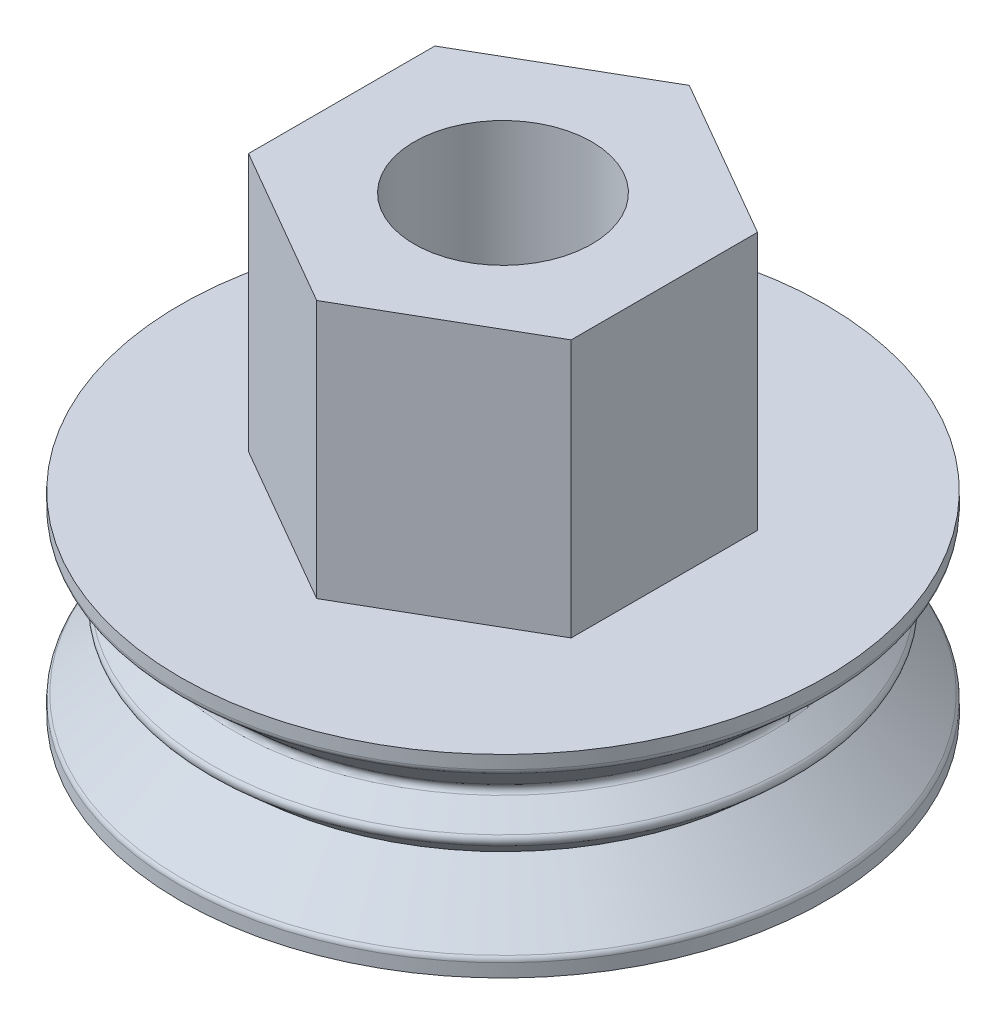
ISO-10303-21;
HEADER;
FILE_DESCRIPTION(('STEP AP214'),'2;1');
FILE_NAME('part.step','',(''),(''),'','','');
FILE_SCHEMA(('AUTOMOTIVE_DESIGN { 1 0 10303 214 1 1 1 1 }'));
ENDSEC;
DATA;
#1=APPLICATION_CONTEXT('core data for automotive mechanical design processes');
#2=APPLICATION_PROTOCOL_DEFINITION('international standard','automotive_design',2000,#1);
#3=PRODUCT_CONTEXT('',#1,'mechanical');
#4=PRODUCT('Part','Part','',(#3));
#5=PRODUCT_RELATED_PRODUCT_CATEGORY('part','',(#4));
#6=PRODUCT_DEFINITION_FORMATION('','',#4);
#7=PRODUCT_DEFINITION_CONTEXT('part definition',#1,'design');
#8=PRODUCT_DEFINITION('design','',#6,#7);
#9=PRODUCT_DEFINITION_SHAPE('','',#8);
#10=(LENGTH_UNIT() NAMED_UNIT(*) SI_UNIT(.MILLI.,.METRE.));
#11=(NAMED_UNIT(*) PLANE_ANGLE_UNIT() SI_UNIT($,.RADIAN.));
#12=(NAMED_UNIT(*) SI_UNIT($,.STERADIAN.) SOLID_ANGLE_UNIT());
#13=UNCERTAINTY_MEASURE_WITH_UNIT(LENGTH_MEASURE(1.E-05),#10,'distance_accuracy_value','');
#14=(GEOMETRIC_REPRESENTATION_CONTEXT(3) GLOBAL_UNCERTAINTY_ASSIGNED_CONTEXT((#13)) GLOBAL_UNIT_ASSIGNED_CONTEXT((#10,
#11,#12)) REPRESENTATION_CONTEXT('',''));
#15=CARTESIAN_POINT('',(0.,0.,0.));
#16=DIRECTION('',(0.,0.,1.));
#17=DIRECTION('',(1.,0.,0.));
#18=AXIS2_PLACEMENT_3D('',#15,#16,#17);
#19=CARTESIAN_POINT('',(6.34999999999995,10.16,-3.66617420935419));
#20=DIRECTION('',(-0.499999999999995,0.,0.866025403784441));
#21=DIRECTION('',(0.866025403784442,0.,0.499999999999995));
#22=AXIS2_PLACEMENT_3D('',#19,#20,#21);
#23=PLANE('',#22);
#24=DIRECTION('',(-0.866025403784442,0.,-0.499999999999995));
#25=VECTOR('',#24,1.);
#26=CARTESIAN_POINT('',(6.34999999999995,0.,-3.66617420935419));
#27=LINE('',#26,#25);
#28=CARTESIAN_POINT('',(6.34999999999995,0.,-3.66617420935419));
#29=VERTEX_POINT('',#28);
#30=CARTESIAN_POINT('',(0.,0.,-7.33234841870824));
#31=VERTEX_POINT('',#30);
#32=EDGE_CURVE('E102',#29,#31,#27,.T.);
#33=ORIENTED_EDGE('',*,*,#32,.T.);
#34=DIRECTION('',(0.,-1.,0.));
#35=VECTOR('',#34,1.);
#36=CARTESIAN_POINT('',(0.,10.16,-7.33234841870824));
#37=LINE('',#36,#35);
#38=CARTESIAN_POINT('',(0.,10.16,-7.33234841870824));
#39=VERTEX_POINT('',#38);
#40=EDGE_CURVE('E130',#39,#31,#37,.T.);
#41=ORIENTED_EDGE('',*,*,#40,.F.);
#42=DIRECTION('',(-0.866025403784442,0.,-0.499999999999995));
#43=VECTOR('',#42,1.);
#44=CARTESIAN_POINT('',(6.34999999999995,10.16,-3.66617420935419));
#45=LINE('',#44,#43);
#46=CARTESIAN_POINT('',(6.34999999999995,10.16,-3.66617420935419));
#47=VERTEX_POINT('',#46);
#48=EDGE_CURVE('E106',#47,#39,#45,.T.);
#49=ORIENTED_EDGE('',*,*,#48,.F.);
#50=DIRECTION('',(0.,-1.,0.));
#51=VECTOR('',#50,1.);
#52=CARTESIAN_POINT('',(6.34999999999995,10.16,-3.66617420935419));
#53=LINE('',#52,#51);
#54=EDGE_CURVE('E119',#47,#29,#53,.T.);
#55=ORIENTED_EDGE('',*,*,#54,.T.);
#56=EDGE_LOOP('',(#33,#41,#49,#55));
#57=FACE_BOUND('',#56,.T.);
#58=ADVANCED_FACE('F47',(#57),#23,.F.);
#59=CARTESIAN_POINT('',(0.,10.16,-7.33234841870824));
#60=DIRECTION('',(0.500000000000001,0.,0.866025403784438));
#61=DIRECTION('',(0.866025403784438,0.,-0.500000000000001));
#62=AXIS2_PLACEMENT_3D('',#59,#60,#61);
#63=PLANE('',#62);
#64=DIRECTION('',(-0.866025403784438,0.,0.500000000000001));
#65=VECTOR('',#64,1.);
#66=CARTESIAN_POINT('',(0.,0.,-7.33234841870824));
#67=LINE('',#66,#65);
#68=CARTESIAN_POINT('',(-6.35,0.,-3.6661742093541));
#69=VERTEX_POINT('',#68);
#70=EDGE_CURVE('E225',#31,#69,#67,.T.);
#71=ORIENTED_EDGE('',*,*,#70,.T.);
#72=DIRECTION('',(0.,-1.,0.));
#73=VECTOR('',#72,1.);
#74=CARTESIAN_POINT('',(-6.35,10.16,-3.6661742093541));
#75=LINE('',#74,#73);
#76=CARTESIAN_POINT('',(-6.35,10.16,-3.6661742093541));
#77=VERTEX_POINT('',#76);
#78=EDGE_CURVE('E127',#77,#69,#75,.T.);
#79=ORIENTED_EDGE('',*,*,#78,.F.);
#80=DIRECTION('',(-0.866025403784438,0.,0.500000000000001));
#81=VECTOR('',#80,1.);
#82=CARTESIAN_POINT('',(0.,10.16,-7.33234841870824));
#83=LINE('',#82,#81);
#84=EDGE_CURVE('E215',#39,#77,#83,.T.);
#85=ORIENTED_EDGE('',*,*,#84,.F.);
#86=ORIENTED_EDGE('',*,*,#40,.T.);
#87=EDGE_LOOP('',(#71,#79,#85,#86));
#88=FACE_BOUND('',#87,.T.);
#89=ADVANCED_FACE('F171',(#88),#63,.F.);
#90=CARTESIAN_POINT('',(-6.35,10.16,-3.6661742093541));
#91=DIRECTION('',(1.,0.,0.));
#92=DIRECTION('',(0.,0.,-1.));
#93=AXIS2_PLACEMENT_3D('',#90,#91,#92);
#94=PLANE('',#93);
#95=DIRECTION('',(0.,0.,1.));
#96=VECTOR('',#95,1.);
#97=CARTESIAN_POINT('',(-6.35,0.,-3.6661742093541));
#98=LINE('',#97,#96);
#99=CARTESIAN_POINT('',(-6.34999999999997,0.,3.66617420935415));
#100=VERTEX_POINT('',#99);
#101=EDGE_CURVE('E228',#69,#100,#98,.T.);
#102=ORIENTED_EDGE('',*,*,#101,.T.);
#103=DIRECTION('',(0.,-1.,0.));
#104=VECTOR('',#103,1.);
#105=CARTESIAN_POINT('',(-6.34999999999997,10.16,3.66617420935415));
#106=LINE('',#105,#104);
#107=CARTESIAN_POINT('',(-6.34999999999997,10.16,3.66617420935415));
#108=VERTEX_POINT('',#107);
#109=EDGE_CURVE('E121',#108,#100,#106,.T.);
#110=ORIENTED_EDGE('',*,*,#109,.F.);
#111=DIRECTION('',(0.,0.,1.));
#112=VECTOR('',#111,1.);
#113=CARTESIAN_POINT('',(-6.35,10.16,-3.6661742093541));
#114=LINE('',#113,#112);
#115=EDGE_CURVE('E217',#77,#108,#114,.T.);
#116=ORIENTED_EDGE('',*,*,#115,.F.);
#117=ORIENTED_EDGE('',*,*,#78,.T.);
#118=EDGE_LOOP('',(#102,#110,#116,#117));
#119=FACE_BOUND('',#118,.T.);
#120=ADVANCED_FACE('F177',(#119),#94,.F.);
#121=CARTESIAN_POINT('',(-6.34999999999997,10.16,3.66617420935415));
#122=DIRECTION('',(0.499999999999995,0.,-0.866025403784441));
#123=DIRECTION('',(-0.866025403784442,0.,-0.499999999999995));
#124=AXIS2_PLACEMENT_3D('',#121,#122,#123);
#125=PLANE('',#124);
#126=DIRECTION('',(0.866025403784442,0.,0.499999999999995));
#127=VECTOR('',#126,1.);
#128=CARTESIAN_POINT('',(-6.34999999999997,0.,3.66617420935415));
#129=LINE('',#128,#127);
#130=CARTESIAN_POINT('',(0.,0.,7.33234841870824));
#131=VERTEX_POINT('',#130);
#132=EDGE_CURVE('E116',#100,#131,#129,.T.);
#133=ORIENTED_EDGE('',*,*,#132,.T.);
#134=DIRECTION('',(0.,-1.,0.));
#135=VECTOR('',#134,1.);
#136=CARTESIAN_POINT('',(0.,10.16,7.33234841870824));
#137=LINE('',#136,#135);
#138=CARTESIAN_POINT('',(0.,10.16,7.33234841870824));
#139=VERTEX_POINT('',#138);
#140=EDGE_CURVE('E115',#139,#131,#137,.T.);
#141=ORIENTED_EDGE('',*,*,#140,.F.);
#142=DIRECTION('',(0.866025403784442,0.,0.499999999999995));
#143=VECTOR('',#142,1.);
#144=CARTESIAN_POINT('',(-6.34999999999997,10.16,3.66617420935415));
#145=LINE('',#144,#143);
#146=EDGE_CURVE('E219',#108,#139,#145,.T.);
#147=ORIENTED_EDGE('',*,*,#146,.F.);
#148=ORIENTED_EDGE('',*,*,#109,.T.);
#149=EDGE_LOOP('',(#133,#141,#147,#148));
#150=FACE_BOUND('',#149,.T.);
#151=ADVANCED_FACE('F232',(#150),#125,.F.);
#152=CARTESIAN_POINT('',(0.,10.16,7.33234841870824));
#153=DIRECTION('',(-0.500000000000007,0.,-0.866025403784435));
#154=DIRECTION('',(-0.866025403784435,0.,0.500000000000007));
#155=AXIS2_PLACEMENT_3D('',#152,#153,#154);
#156=PLANE('',#155);
#157=DIRECTION('',(0.866025403784435,0.,-0.500000000000007));
#158=VECTOR('',#157,1.);
#159=CARTESIAN_POINT('',(0.,0.,7.33234841870824));
#160=LINE('',#159,#158);
#161=CARTESIAN_POINT('',(6.35000000000002,0.,3.66617420935406));
#162=VERTEX_POINT('',#161);
#163=EDGE_CURVE('E99',#131,#162,#160,.T.);
#164=ORIENTED_EDGE('',*,*,#163,.T.);
#165=DIRECTION('',(0.,-1.,0.));
#166=VECTOR('',#165,1.);
#167=CARTESIAN_POINT('',(6.35000000000002,10.16,3.66617420935406));
#168=LINE('',#167,#166);
#169=CARTESIAN_POINT('',(6.35000000000002,10.16,3.66617420935406));
#170=VERTEX_POINT('',#169);
#171=EDGE_CURVE('E113',#170,#162,#168,.T.);
#172=ORIENTED_EDGE('',*,*,#171,.F.);
#173=DIRECTION('',(0.866025403784435,0.,-0.500000000000007));
#174=VECTOR('',#173,1.);
#175=CARTESIAN_POINT('',(0.,10.16,7.33234841870824));
#176=LINE('',#175,#174);
#177=EDGE_CURVE('E221',#139,#170,#176,.T.);
#178=ORIENTED_EDGE('',*,*,#177,.F.);
#179=ORIENTED_EDGE('',*,*,#140,.T.);
#180=EDGE_LOOP('',(#164,#172,#178,#179));
#181=FACE_BOUND('',#180,.T.);
#182=ADVANCED_FACE('F111',(#181),#156,.F.);
#183=CARTESIAN_POINT('',(6.35000000000002,10.16,3.66617420935406));
#184=DIRECTION('',(-1.,0.,0.));
#185=DIRECTION('',(0.,0.,1.));
#186=AXIS2_PLACEMENT_3D('',#183,#184,#185);
#187=PLANE('',#186);
#188=DIRECTION('',(0.,0.,-1.));
#189=VECTOR('',#188,1.);
#190=CARTESIAN_POINT('',(6.35000000000002,0.,3.66617420935406));
#191=LINE('',#190,#189);
#192=EDGE_CURVE('E96',#162,#29,#191,.T.);
#193=ORIENTED_EDGE('',*,*,#192,.T.);
#194=ORIENTED_EDGE('',*,*,#54,.F.);
#195=DIRECTION('',(0.,0.,-1.));
#196=VECTOR('',#195,1.);
#197=CARTESIAN_POINT('',(6.35000000000002,10.16,3.66617420935406));
#198=LINE('',#197,#196);
#199=EDGE_CURVE('E63',#170,#47,#198,.T.);
#200=ORIENTED_EDGE('',*,*,#199,.F.);
#201=ORIENTED_EDGE('',*,*,#171,.T.);
#202=EDGE_LOOP('',(#193,#194,#200,#201));
#203=FACE_BOUND('',#202,.T.);
#204=ADVANCED_FACE('F118',(#203),#187,.F.);
#205=CARTESIAN_POINT('',(0.,10.16,0.));
#206=DIRECTION('',(0.,1.,0.));
#207=DIRECTION('',(0.,0.,1.));
#208=AXIS2_PLACEMENT_3D('',#205,#206,#207);
#209=PLANE('',#208);
#210=CARTESIAN_POINT('',(0.,10.16,0.));
#211=DIRECTION('',(0.,-1.,0.));
#212=DIRECTION('',(0.,0.,-1.));
#213=AXIS2_PLACEMENT_3D('',#210,#211,#212);
#214=CIRCLE('',#213,3.4925);
#215=CARTESIAN_POINT('',(0.,10.16,-3.4925));
#216=VERTEX_POINT('',#215);
#217=EDGE_CURVE('E210',#216,#216,#214,.T.);
#218=ORIENTED_EDGE('',*,*,#217,.T.);
#219=EDGE_LOOP('',(#218));
#220=FACE_BOUND('',#219,.T.);
#221=ORIENTED_EDGE('',*,*,#48,.T.);
#222=ORIENTED_EDGE('',*,*,#84,.T.);
#223=ORIENTED_EDGE('',*,*,#115,.T.);
#224=ORIENTED_EDGE('',*,*,#146,.T.);
#225=ORIENTED_EDGE('',*,*,#177,.T.);
#226=ORIENTED_EDGE('',*,*,#199,.T.);
#227=EDGE_LOOP('',(#221,#222,#223,#224,#225,#226));
#228=FACE_BOUND('',#227,.T.);
#229=ADVANCED_FACE('F240',(#220,#228),#209,.T.);
#230=CARTESIAN_POINT('',(0.,0.,0.));
#231=DIRECTION('',(0.,-1.,0.));
#232=DIRECTION('',(0.,0.,-1.));
#233=AXIS2_PLACEMENT_3D('',#230,#231,#232);
#234=PLANE('',#233);
#235=CARTESIAN_POINT('',(0.,0.,0.));
#236=DIRECTION('',(0.,-1.,0.));
#237=DIRECTION('',(0.,0.,-1.));
#238=AXIS2_PLACEMENT_3D('',#235,#236,#237);
#239=CIRCLE('',#238,12.7);
#240=CARTESIAN_POINT('',(0.,0.,-12.7));
#241=VERTEX_POINT('',#240);
#242=EDGE_CURVE('E204',#241,#241,#239,.T.);
#243=ORIENTED_EDGE('',*,*,#242,.F.);
#244=EDGE_LOOP('',(#243));
#245=FACE_BOUND('',#244,.T.);
#246=ORIENTED_EDGE('',*,*,#70,.F.);
#247=ORIENTED_EDGE('',*,*,#32,.F.);
#248=ORIENTED_EDGE('',*,*,#192,.F.);
#249=ORIENTED_EDGE('',*,*,#163,.F.);
#250=ORIENTED_EDGE('',*,*,#132,.F.);
#251=ORIENTED_EDGE('',*,*,#101,.F.);
#252=EDGE_LOOP('',(#246,#247,#248,#249,#250,#251));
#253=FACE_BOUND('',#252,.T.);
#254=ADVANCED_FACE('F98',(#245,#253),#234,.F.);
#255=CARTESIAN_POINT('',(0.,-7.62,0.));
#256=DIRECTION('',(0.,-1.,0.));
#257=DIRECTION('',(0.,0.,-1.));
#258=AXIS2_PLACEMENT_3D('',#255,#256,#257);
#259=CYLINDRICAL_SURFACE('',#258,12.7);
#260=CARTESIAN_POINT('',(0.,-0.520957163789965,0.));
#261=DIRECTION('',(0.,1.,0.));
#262=DIRECTION('',(0.,0.,1.));
#263=AXIS2_PLACEMENT_3D('',#260,#261,#262);
#264=CIRCLE('',#263,12.7);
#265=CARTESIAN_POINT('',(0.,-0.520957163789965,12.7));
#266=VERTEX_POINT('',#265);
#267=EDGE_CURVE('E148',#266,#266,#264,.T.);
#268=ORIENTED_EDGE('',*,*,#267,.T.);
#269=EDGE_LOOP('',(#268));
#270=FACE_BOUND('',#269,.T.);
#271=ORIENTED_EDGE('',*,*,#242,.T.);
#272=EDGE_LOOP('',(#271));
#273=FACE_BOUND('',#272,.T.);
#274=ADVANCED_FACE('F248',(#270,#273),#259,.T.);
#275=CARTESIAN_POINT('',(0.,-0.634999999999999,0.));
#276=DIRECTION('',(0.,1.,0.));
#277=DIRECTION('',(0.,0.,1.));
#278=AXIS2_PLACEMENT_3D('',#275,#276,#277);
#279=CONICAL_SURFACE('',#278,12.7,0.844023296136495);
#280=CARTESIAN_POINT('',(0.,-0.710777075388013,0.));
#281=DIRECTION('',(0.,-1.,0.));
#282=DIRECTION('',(0.,0.,-1.));
#283=AXIS2_PLACEMENT_3D('',#280,#281,#282);
#284=CIRCLE('',#283,12.6147732240639);
#285=CARTESIAN_POINT('',(0.,-0.710777075388013,-12.6147732240639));
#286=VERTEX_POINT('',#285);
#287=EDGE_CURVE('E145',#286,#286,#284,.T.);
#288=ORIENTED_EDGE('',*,*,#287,.T.);
#289=EDGE_LOOP('',(#288));
#290=FACE_BOUND('',#289,.T.);
#291=CARTESIAN_POINT('',(0.,-2.49099404697662,0.));
#292=DIRECTION('',(0.,1.,0.));
#293=DIRECTION('',(0.,0.,1.));
#294=AXIS2_PLACEMENT_3D('',#291,#292,#293);
#295=CIRCLE('',#294,10.6125561659574);
#296=CARTESIAN_POINT('',(0.,-2.49099404697662,10.6125561659574));
#297=VERTEX_POINT('',#296);
#298=EDGE_CURVE('E142',#297,#297,#295,.T.);
#299=ORIENTED_EDGE('',*,*,#298,.T.);
#300=EDGE_LOOP('',(#299));
#301=FACE_BOUND('',#300,.T.);
#302=ADVANCED_FACE('F291',(#290,#301),#279,.T.);
#303=CARTESIAN_POINT('',(0.,-2.68081395857467,0.));
#304=DIRECTION('',(0.,-1.,0.));
#305=DIRECTION('',(0.,0.,-1.));
#306=AXIS2_PLACEMENT_3D('',#303,#304,#305);
#307=CONICAL_SURFACE('',#306,10.3990649617753,0.844023296136494);
#308=CARTESIAN_POINT('',(0.,-3.62018008840196,0.));
#309=DIRECTION('',(0.,1.,0.));
#310=DIRECTION('',(0.,0.,1.));
#311=AXIS2_PLACEMENT_3D('',#308,#309,#310);
#312=CIRCLE('',#311,11.4555737575932);
#313=CARTESIAN_POINT('',(0.,-3.62018008840196,11.4555737575932));
#314=VERTEX_POINT('',#313);
#315=EDGE_CURVE('E139',#314,#314,#312,.T.);
#316=ORIENTED_EDGE('',*,*,#315,.T.);
#317=EDGE_LOOP('',(#316));
#318=FACE_BOUND('',#317,.T.);
#319=CARTESIAN_POINT('',(0.,-2.87063387017271,0.));
#320=DIRECTION('',(0.,-1.,0.));
#321=DIRECTION('',(0.,0.,-1.));
#322=AXIS2_PLACEMENT_3D('',#319,#320,#321);
#323=CIRCLE('',#322,10.6125561659574);
#324=CARTESIAN_POINT('',(0.,-2.87063387017271,-10.6125561659574));
#325=VERTEX_POINT('',#324);
#326=EDGE_CURVE('E136',#325,#325,#323,.T.);
#327=ORIENTED_EDGE('',*,*,#326,.T.);
#328=EDGE_LOOP('',(#327));
#329=FACE_BOUND('',#328,.T.);
#330=ADVANCED_FACE('F198',(#318,#329),#307,.T.);
#331=CARTESIAN_POINT('',(0.,-3.81,0.));
#332=DIRECTION('',(0.,1.,0.));
#333=DIRECTION('',(0.,0.,1.));
#334=AXIS2_PLACEMENT_3D('',#331,#332,#333);
#335=CONICAL_SURFACE('',#334,11.6690649617753,0.844023296136495);
#336=CARTESIAN_POINT('',(0.,-3.99981991159804,0.));
#337=DIRECTION('',(0.,-1.,0.));
#338=DIRECTION('',(0.,0.,-1.));
#339=AXIS2_PLACEMENT_3D('',#336,#337,#338);
#340=CIRCLE('',#339,11.4555737575932);
#341=CARTESIAN_POINT('',(0.,-3.99981991159804,-11.4555737575932));
#342=VERTEX_POINT('',#341);
#343=EDGE_CURVE('E133',#342,#342,#340,.T.);
#344=ORIENTED_EDGE('',*,*,#343,.T.);
#345=EDGE_LOOP('',(#344));
#346=FACE_BOUND('',#345,.T.);
#347=CARTESIAN_POINT('',(0.,-4.93918604142533,0.));
#348=DIRECTION('',(0.,-1.,0.));
#349=DIRECTION('',(0.,0.,-1.));
#350=AXIS2_PLACEMENT_3D('',#347,#348,#349);
#351=CIRCLE('',#350,10.3990649617753);
#352=CARTESIAN_POINT('',(0.,-4.93918604142533,-10.3990649617753));
#353=VERTEX_POINT('',#352);
#354=EDGE_CURVE('E202',#353,#353,#351,.T.);
#355=ORIENTED_EDGE('',*,*,#354,.F.);
#356=EDGE_LOOP('',(#355));
#357=FACE_BOUND('',#356,.T.);
#358=ADVANCED_FACE('F194',(#346,#357),#335,.T.);
#359=CARTESIAN_POINT('',(0.,-4.93918604142533,0.));
#360=DIRECTION('',(0.,-1.,0.));
#361=DIRECTION('',(0.,0.,-1.));
#362=AXIS2_PLACEMENT_3D('',#359,#360,#361);
#363=CONICAL_SURFACE('',#362,10.3990649617753,0.844023296136495);
#364=CARTESIAN_POINT('',(0.,-6.90922292461199,0.));
#365=DIRECTION('',(0.,1.,0.));
#366=DIRECTION('',(0.,0.,1.));
#367=AXIS2_PLACEMENT_3D('',#364,#365,#366);
#368=CIRCLE('',#367,12.6147732240639);
#369=CARTESIAN_POINT('',(0.,-6.90922292461199,12.6147732240639));
#370=VERTEX_POINT('',#369);
#371=EDGE_CURVE('E13',#370,#370,#368,.T.);
#372=ORIENTED_EDGE('',*,*,#371,.T.);
#373=EDGE_LOOP('',(#372));
#374=FACE_BOUND('',#373,.T.);
#375=ORIENTED_EDGE('',*,*,#354,.T.);
#376=EDGE_LOOP('',(#375));
#377=FACE_BOUND('',#376,.T.);
#378=ADVANCED_FACE('F197',(#374,#377),#363,.T.);
#379=CARTESIAN_POINT('',(0.,-7.62,0.));
#380=DIRECTION('',(0.,-1.,0.));
#381=DIRECTION('',(0.,0.,-1.));
#382=AXIS2_PLACEMENT_3D('',#379,#380,#381);
#383=CYLINDRICAL_SURFACE('',#382,12.7);
#384=CARTESIAN_POINT('',(0.,-7.09904283621003,0.));
#385=DIRECTION('',(0.,1.,0.));
#386=DIRECTION('',(0.,0.,1.));
#387=AXIS2_PLACEMENT_3D('',#384,#385,#386);
#388=CIRCLE('',#387,12.7);
#389=CARTESIAN_POINT('',(0.,-7.09904283621003,12.7));
#390=VERTEX_POINT('',#389);
#391=EDGE_CURVE('E56',#390,#390,#388,.F.);
#392=ORIENTED_EDGE('',*,*,#391,.T.);
#393=EDGE_LOOP('',(#392));
#394=FACE_BOUND('',#393,.T.);
#395=CARTESIAN_POINT('',(0.,-7.62,0.));
#396=DIRECTION('',(0.,-1.,0.));
#397=DIRECTION('',(0.,0.,-1.));
#398=AXIS2_PLACEMENT_3D('',#395,#396,#397);
#399=CIRCLE('',#398,12.7);
#400=CARTESIAN_POINT('',(0.,-7.62,-12.7));
#401=VERTEX_POINT('',#400);
#402=EDGE_CURVE('E205',#401,#401,#399,.T.);
#403=ORIENTED_EDGE('',*,*,#402,.F.);
#404=EDGE_LOOP('',(#403));
#405=FACE_BOUND('',#404,.T.);
#406=ADVANCED_FACE('F153',(#394,#405),#383,.T.);
#407=CARTESIAN_POINT('',(-12.7,-7.62,0.));
#408=DIRECTION('',(0.,1.,0.));
#409=DIRECTION('',(0.,0.,1.));
#410=AXIS2_PLACEMENT_3D('',#407,#408,#409);
#411=PLANE('',#410);
#412=CARTESIAN_POINT('',(0.,-7.62,0.));
#413=DIRECTION('',(0.,-1.,0.));
#414=DIRECTION('',(0.,0.,-1.));
#415=AXIS2_PLACEMENT_3D('',#412,#413,#414);
#416=CIRCLE('',#415,3.4925);
#417=CARTESIAN_POINT('',(0.,-7.62,-3.4925));
#418=VERTEX_POINT('',#417);
#419=EDGE_CURVE('E378',#418,#418,#416,.T.);
#420=ORIENTED_EDGE('',*,*,#419,.F.);
#421=EDGE_LOOP('',(#420));
#422=FACE_BOUND('',#421,.T.);
#423=ORIENTED_EDGE('',*,*,#402,.T.);
#424=EDGE_LOOP('',(#423));
#425=FACE_BOUND('',#424,.T.);
#426=ADVANCED_FACE('F183',(#422,#425),#411,.F.);
#427=CARTESIAN_POINT('',(0.,-3.81,0.));
#428=DIRECTION('',(0.,1.,0.));
#429=DIRECTION('',(0.,0.,1.));
#430=AXIS2_PLACEMENT_3D('',#427,#428,#429);
#431=TOROIDAL_SURFACE('',#430,11.2868005335293,0.254);
#432=ORIENTED_EDGE('',*,*,#315,.F.);
#433=EDGE_LOOP('',(#432));
#434=FACE_BOUND('',#433,.T.);
#435=ORIENTED_EDGE('',*,*,#343,.F.);
#436=EDGE_LOOP('',(#435));
#437=FACE_BOUND('',#436,.T.);
#438=ADVANCED_FACE('F166',(#434,#437),#431,.T.);
#439=CARTESIAN_POINT('',(0.,-0.520957163789965,0.));
#440=DIRECTION('',(0.,1.,0.));
#441=DIRECTION('',(0.,0.,1.));
#442=AXIS2_PLACEMENT_3D('',#439,#440,#441);
#443=TOROIDAL_SURFACE('',#442,12.446,0.254);
#444=ORIENTED_EDGE('',*,*,#267,.F.);
#445=EDGE_LOOP('',(#444));
#446=FACE_BOUND('',#445,.T.);
#447=ORIENTED_EDGE('',*,*,#287,.F.);
#448=EDGE_LOOP('',(#447));
#449=FACE_BOUND('',#448,.T.);
#450=ADVANCED_FACE('F158',(#446,#449),#443,.T.);
#451=CARTESIAN_POINT('',(0.,-7.09904283621003,0.));
#452=DIRECTION('',(0.,1.,0.));
#453=DIRECTION('',(0.,0.,1.));
#454=AXIS2_PLACEMENT_3D('',#451,#452,#453);
#455=TOROIDAL_SURFACE('',#454,12.446,0.254);
#456=ORIENTED_EDGE('',*,*,#371,.F.);
#457=EDGE_LOOP('',(#456));
#458=FACE_BOUND('',#457,.T.);
#459=ORIENTED_EDGE('',*,*,#391,.F.);
#460=EDGE_LOOP('',(#459));
#461=FACE_BOUND('',#460,.T.);
#462=ADVANCED_FACE('F156',(#458,#461),#455,.T.);
#463=CARTESIAN_POINT('',(0.,-2.68081395857467,0.));
#464=DIRECTION('',(0.,-1.,0.));
#465=DIRECTION('',(0.,0.,-1.));
#466=AXIS2_PLACEMENT_3D('',#463,#464,#465);
#467=TOROIDAL_SURFACE('',#466,10.7813293900212,0.254);
#468=ORIENTED_EDGE('',*,*,#298,.F.);
#469=EDGE_LOOP('',(#468));
#470=FACE_BOUND('',#469,.T.);
#471=ORIENTED_EDGE('',*,*,#326,.F.);
#472=EDGE_LOOP('',(#471));
#473=FACE_BOUND('',#472,.T.);
#474=ADVANCED_FACE('F49',(#470,#473),#467,.F.);
#475=CARTESIAN_POINT('',(0.,10.16,0.));
#476=DIRECTION('',(0.,-1.,0.));
#477=DIRECTION('',(0.,0.,-1.));
#478=AXIS2_PLACEMENT_3D('',#475,#476,#477);
#479=CYLINDRICAL_SURFACE('',#478,3.4925);
#480=CARTESIAN_POINT('',(0.,10.16,-3.4925));
#481=CARTESIAN_POINT('',(0.,9.97479166666667,-3.4925));
#482=CARTESIAN_POINT('',(0.,9.78958333333334,-3.4925));
#483=CARTESIAN_POINT('',(0.,9.41916666666667,-3.4925));
#484=CARTESIAN_POINT('',(0.,9.23395833333334,-3.4925));
#485=CARTESIAN_POINT('',(0.,8.86354166666667,-3.4925));
#486=CARTESIAN_POINT('',(0.,8.67833333333334,-3.4925));
#487=CARTESIAN_POINT('',(0.,8.30791666666667,-3.4925));
#488=CARTESIAN_POINT('',(0.,8.12270833333334,-3.4925));
#489=CARTESIAN_POINT('',(0.,7.75229166666667,-3.4925));
#490=CARTESIAN_POINT('',(0.,7.56708333333334,-3.4925));
#491=CARTESIAN_POINT('',(0.,7.19666666666667,-3.4925));
#492=CARTESIAN_POINT('',(0.,7.01145833333334,-3.4925));
#493=CARTESIAN_POINT('',(0.,6.64104166666667,-3.4925));
#494=CARTESIAN_POINT('',(0.,6.45583333333334,-3.4925));
#495=CARTESIAN_POINT('',(0.,6.08541666666667,-3.4925));
#496=CARTESIAN_POINT('',(0.,5.90020833333334,-3.4925));
#497=CARTESIAN_POINT('',(0.,5.52979166666667,-3.4925));
#498=CARTESIAN_POINT('',(0.,5.34458333333334,-3.4925));
#499=CARTESIAN_POINT('',(0.,4.97416666666667,-3.4925));
#500=CARTESIAN_POINT('',(0.,4.78895833333334,-3.4925));
#501=CARTESIAN_POINT('',(0.,4.41854166666667,-3.4925));
#502=CARTESIAN_POINT('',(0.,4.23333333333334,-3.4925));
#503=CARTESIAN_POINT('',(0.,3.86291666666667,-3.4925));
#504=CARTESIAN_POINT('',(0.,3.67770833333334,-3.4925));
#505=CARTESIAN_POINT('',(0.,3.30729166666667,-3.4925));
#506=CARTESIAN_POINT('',(0.,3.12208333333334,-3.4925));
#507=CARTESIAN_POINT('',(0.,2.75166666666667,-3.4925));
#508=CARTESIAN_POINT('',(0.,2.56645833333334,-3.4925));
#509=CARTESIAN_POINT('',(0.,2.19604166666667,-3.4925));
#510=CARTESIAN_POINT('',(0.,2.01083333333334,-3.4925));
#511=CARTESIAN_POINT('',(0.,1.64041666666667,-3.4925));
#512=CARTESIAN_POINT('',(0.,1.45520833333334,-3.4925));
#513=CARTESIAN_POINT('',(0.,1.08479166666667,-3.4925));
#514=CARTESIAN_POINT('',(0.,0.899583333333337,-3.4925));
#515=CARTESIAN_POINT('',(0.,0.52916666666667,-3.4925));
#516=CARTESIAN_POINT('',(0.,0.343958333333336,-3.4925));
#517=CARTESIAN_POINT('',(0.,-0.0264583333333303,-3.4925));
#518=CARTESIAN_POINT('',(0.,-0.211666666666663,-3.4925));
#519=CARTESIAN_POINT('',(0.,-0.58208333333333,-3.4925));
#520=CARTESIAN_POINT('',(0.,-0.767291666666663,-3.4925));
#521=CARTESIAN_POINT('',(0.,-1.13770833333333,-3.4925));
#522=CARTESIAN_POINT('',(0.,-1.32291666666666,-3.4925));
#523=CARTESIAN_POINT('',(0.,-1.69333333333333,-3.4925));
#524=CARTESIAN_POINT('',(0.,-1.87854166666666,-3.4925));
#525=CARTESIAN_POINT('',(0.,-2.24895833333333,-3.4925));
#526=CARTESIAN_POINT('',(0.,-2.43416666666666,-3.4925));
#527=CARTESIAN_POINT('',(0.,-2.80458333333333,-3.4925));
#528=CARTESIAN_POINT('',(0.,-2.98979166666666,-3.4925));
#529=CARTESIAN_POINT('',(0.,-3.36020833333333,-3.4925));
#530=CARTESIAN_POINT('',(0.,-3.54541666666666,-3.4925));
#531=CARTESIAN_POINT('',(0.,-3.91583333333333,-3.4925));
#532=CARTESIAN_POINT('',(0.,-4.10104166666667,-3.4925));
#533=CARTESIAN_POINT('',(0.,-4.47145833333333,-3.4925));
#534=CARTESIAN_POINT('',(0.,-4.65666666666666,-3.4925));
#535=CARTESIAN_POINT('',(0.,-5.02708333333333,-3.4925));
#536=CARTESIAN_POINT('',(0.,-5.21229166666666,-3.4925));
#537=CARTESIAN_POINT('',(0.,-5.58270833333333,-3.4925));
#538=CARTESIAN_POINT('',(0.,-5.76791666666666,-3.4925));
#539=CARTESIAN_POINT('',(0.,-6.13833333333333,-3.4925));
#540=CARTESIAN_POINT('',(0.,-6.32354166666666,-3.4925));
#541=CARTESIAN_POINT('',(0.,-6.69395833333333,-3.4925));
#542=CARTESIAN_POINT('',(0.,-6.87916666666666,-3.4925));
#543=CARTESIAN_POINT('',(0.,-7.24958333333333,-3.4925));
#544=CARTESIAN_POINT('',(0.,-7.43479166666666,-3.4925));
#545=CARTESIAN_POINT('',(0.,-7.62,-3.4925));
#546=B_SPLINE_CURVE_WITH_KNOTS('',3,(#480,#481,#482,#483,#484,#485,#486,#487,#488,#489,#490,
#491,#492,#493,#494,#495,#496,#497,#498,#499,#500,#501,#502,#503,#504,#505,#506,#507,#508,#509,
#510,#511,#512,#513,#514,#515,#516,#517,#518,#519,#520,#521,#522,#523,#524,#525,#526,#527,#528,
#529,#530,#531,#532,#533,#534,#535,#536,#537,#538,#539,#540,#541,#542,#543,#544,#545),
.UNSPECIFIED.,.F.,.F.,(4,2,2,2,2,2,2,2,2,2,2,2,2,2,2,2,2,2,2,2,2,2,2,2,2,2,2,2,2,2,2,2,4),(0.,
0.555625000000001,1.11125,1.666875,2.2225,2.778125,3.33375,3.889375,4.445,5.000625,5.55625,
6.111875,6.6675,7.223125,7.77875,8.334375,8.89,9.445625,10.00125,10.556875,11.1125,11.668125,
12.22375,12.779375,13.335,13.890625,14.44625,15.001875,15.5575,16.113125,16.66875,17.224375,
17.78),.UNSPECIFIED.);
#547=EDGE_CURVE('BSEAM164',#216,#418,#546,.T.);
#548=ORIENTED_EDGE('',*,*,#217,.F.);
#549=ORIENTED_EDGE('',*,*,#419,.T.);
#550=ORIENTED_EDGE('',*,*,#547,.T.);
#551=ORIENTED_EDGE('',*,*,#547,.F.);
#552=EDGE_LOOP('',(#548,#550,#549,#551));
#553=FACE_BOUND('',#552,.T.);
#554=ADVANCED_FACE('F164',(#553),#479,.F.);
#555=CLOSED_SHELL('',(#58,#89,#120,#151,#182,#204,#229,#254,#274,#302,#330,#358,#378,#406,#426,
#438,#450,#462,#474,#554));
#556=MANIFOLD_SOLID_BREP('B2',#555);
#557=ADVANCED_BREP_SHAPE_REPRESENTATION('',(#18,#556),#14);
#558=SHAPE_DEFINITION_REPRESENTATION(#9,#557);
ENDSEC;
END-ISO-10303-21;
